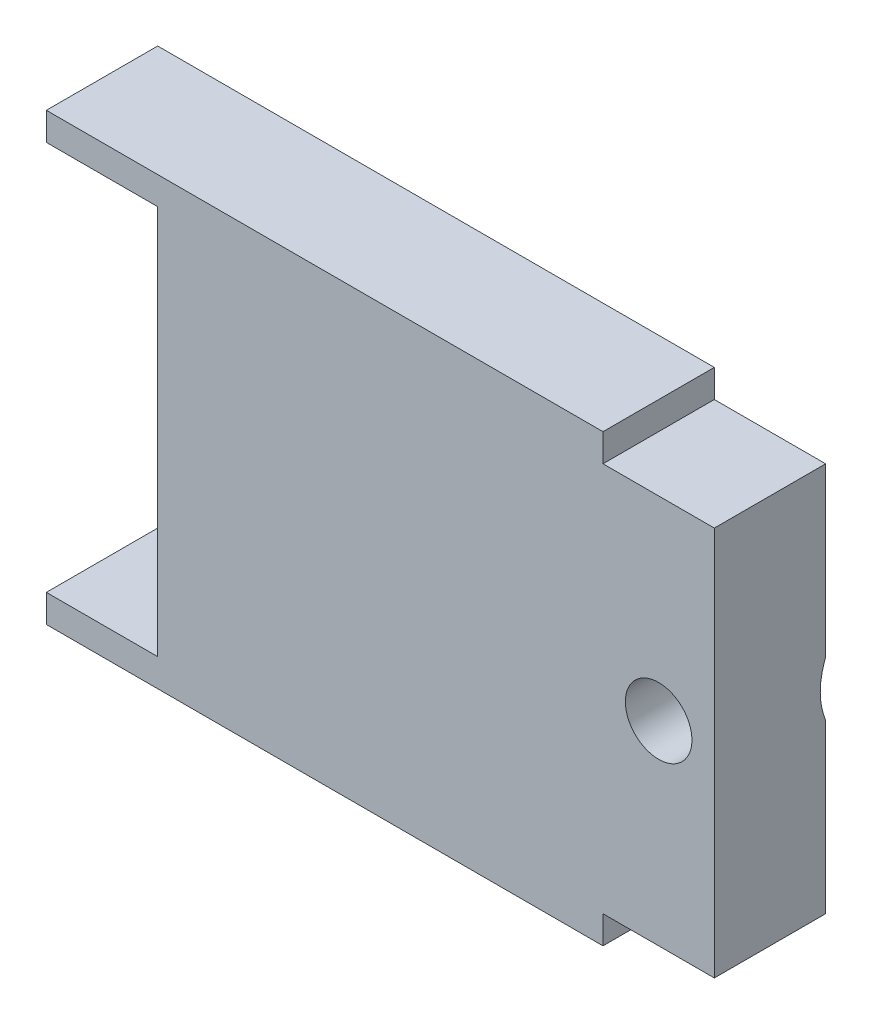
ISO-10303-21;
HEADER;
FILE_DESCRIPTION(('STEP AP214'),'2;1');
FILE_NAME('part.step','',(''),(''),'','','');
FILE_SCHEMA(('AUTOMOTIVE_DESIGN { 1 0 10303 214 1 1 1 1 }'));
ENDSEC;
DATA;
#1=APPLICATION_CONTEXT('core data for automotive mechanical design processes');
#2=APPLICATION_PROTOCOL_DEFINITION('international standard','automotive_design',2000,#1);
#3=PRODUCT_CONTEXT('',#1,'mechanical');
#4=PRODUCT('Part','Part','',(#3));
#5=PRODUCT_RELATED_PRODUCT_CATEGORY('part','',(#4));
#6=PRODUCT_DEFINITION_FORMATION('','',#4);
#7=PRODUCT_DEFINITION_CONTEXT('part definition',#1,'design');
#8=PRODUCT_DEFINITION('design','',#6,#7);
#9=PRODUCT_DEFINITION_SHAPE('','',#8);
#10=(LENGTH_UNIT() NAMED_UNIT(*) SI_UNIT(.MILLI.,.METRE.));
#11=(NAMED_UNIT(*) PLANE_ANGLE_UNIT() SI_UNIT($,.RADIAN.));
#12=(NAMED_UNIT(*) SI_UNIT($,.STERADIAN.) SOLID_ANGLE_UNIT());
#13=UNCERTAINTY_MEASURE_WITH_UNIT(LENGTH_MEASURE(1.E-05),#10,'distance_accuracy_value','');
#14=(GEOMETRIC_REPRESENTATION_CONTEXT(3) GLOBAL_UNCERTAINTY_ASSIGNED_CONTEXT((#13)) GLOBAL_UNIT_ASSIGNED_CONTEXT((#10,
#11,#12)) REPRESENTATION_CONTEXT('',''));
#15=CARTESIAN_POINT('',(0.,0.,0.));
#16=DIRECTION('',(0.,0.,1.));
#17=DIRECTION('',(1.,0.,0.));
#18=AXIS2_PLACEMENT_3D('',#15,#16,#17);
#19=CARTESIAN_POINT('',(-6.35,0.,6.35));
#20=DIRECTION('',(1.,0.,0.));
#21=DIRECTION('',(0.,1.,0.));
#22=AXIS2_PLACEMENT_3D('',#19,#20,#21);
#23=PLANE('',#22);
#24=DIRECTION('',(0.,-1.,0.));
#25=VECTOR('',#24,1.);
#26=CARTESIAN_POINT('',(-6.35,0.,0.));
#27=LINE('',#26,#25);
#28=CARTESIAN_POINT('',(-6.35,1.5875,0.));
#29=VERTEX_POINT('',#28);
#30=CARTESIAN_POINT('',(-6.35,0.,0.));
#31=VERTEX_POINT('',#30);
#32=EDGE_CURVE('E184',#29,#31,#27,.T.);
#33=ORIENTED_EDGE('',*,*,#32,.F.);
#34=DIRECTION('',(0.,0.,-1.));
#35=VECTOR('',#34,1.);
#36=CARTESIAN_POINT('',(-6.35,1.5875,6.35));
#37=LINE('',#36,#35);
#38=CARTESIAN_POINT('',(-6.35,1.5875,6.35));
#39=VERTEX_POINT('',#38);
#40=EDGE_CURVE('E40',#39,#29,#37,.T.);
#41=ORIENTED_EDGE('',*,*,#40,.F.);
#42=DIRECTION('',(0.,-1.,0.));
#43=VECTOR('',#42,1.);
#44=CARTESIAN_POINT('',(-6.35,0.,6.35));
#45=LINE('',#44,#43);
#46=CARTESIAN_POINT('',(-6.35,0.,6.35));
#47=VERTEX_POINT('',#46);
#48=EDGE_CURVE('E178',#39,#47,#45,.T.);
#49=ORIENTED_EDGE('',*,*,#48,.T.);
#50=DIRECTION('',(0.,0.,-1.));
#51=VECTOR('',#50,1.);
#52=CARTESIAN_POINT('',(-6.35,0.,6.35));
#53=LINE('',#52,#51);
#54=EDGE_CURVE('E54',#47,#31,#53,.T.);
#55=ORIENTED_EDGE('',*,*,#54,.T.);
#56=EDGE_LOOP('',(#33,#41,#49,#55));
#57=FACE_BOUND('',#56,.T.);
#58=ADVANCED_FACE('F33',(#57),#23,.T.);
#59=CARTESIAN_POINT('',(0.,1.5875,6.35));
#60=DIRECTION('',(0.,-1.,0.));
#61=DIRECTION('',(1.,0.,0.));
#62=AXIS2_PLACEMENT_3D('',#59,#60,#61);
#63=PLANE('',#62);
#64=DIRECTION('',(-1.,0.,0.));
#65=VECTOR('',#64,1.);
#66=CARTESIAN_POINT('',(0.,1.5875,0.));
#67=LINE('',#66,#65);
#68=CARTESIAN_POINT('',(0.,1.5875,0.));
#69=VERTEX_POINT('',#68);
#70=EDGE_CURVE('E261',#69,#29,#67,.T.);
#71=ORIENTED_EDGE('',*,*,#70,.F.);
#72=DIRECTION('',(0.,0.,-1.));
#73=VECTOR('',#72,1.);
#74=CARTESIAN_POINT('',(0.,1.5875,6.35));
#75=LINE('',#74,#73);
#76=CARTESIAN_POINT('',(0.,1.5875,6.35));
#77=VERTEX_POINT('',#76);
#78=EDGE_CURVE('E309',#77,#69,#75,.T.);
#79=ORIENTED_EDGE('',*,*,#78,.F.);
#80=DIRECTION('',(-1.,0.,0.));
#81=VECTOR('',#80,1.);
#82=CARTESIAN_POINT('',(0.,1.5875,6.35));
#83=LINE('',#82,#81);
#84=EDGE_CURVE('E175',#77,#39,#83,.T.);
#85=ORIENTED_EDGE('',*,*,#84,.T.);
#86=ORIENTED_EDGE('',*,*,#40,.T.);
#87=EDGE_LOOP('',(#71,#79,#85,#86));
#88=FACE_BOUND('',#87,.T.);
#89=ADVANCED_FACE('F252',(#88),#63,.T.);
#90=CARTESIAN_POINT('',(0.,0.,6.35));
#91=DIRECTION('',(-1.,0.,0.));
#92=DIRECTION('',(0.,-1.,0.));
#93=AXIS2_PLACEMENT_3D('',#90,#91,#92);
#94=PLANE('',#93);
#95=DIRECTION('',(0.,1.,0.));
#96=VECTOR('',#95,1.);
#97=CARTESIAN_POINT('',(0.,0.,0.));
#98=LINE('',#97,#96);
#99=CARTESIAN_POINT('',(0.,11.126993359836,0.));
#100=VERTEX_POINT('',#99);
#101=EDGE_CURVE('E267',#69,#100,#98,.T.);
#102=ORIENTED_EDGE('',*,*,#101,.T.);
#103=CARTESIAN_POINT('',(0.,-1.56658730474791,-9.29077360985219));
#104=CARTESIAN_POINT('',(0.,-1.16317084431735,-8.96037932404535));
#105=CARTESIAN_POINT('',(0.,-0.759456326242653,-8.63034755380192));
#106=CARTESIAN_POINT('',(0.,0.0488607889960544,-7.97128256367705));
#107=CARTESIAN_POINT('',(0.,0.453463479101647,-7.64224945781425));
#108=CARTESIAN_POINT('',(0.,1.26534390944595,-6.98424463935165));
#109=CARTESIAN_POINT('',(0.,1.67262592393552,-6.6552781948735));
#110=CARTESIAN_POINT('',(0.,2.48865166465612,-5.99924655453938));
#111=CARTESIAN_POINT('',(0.,2.89739524092196,-5.67218117217986));
#112=CARTESIAN_POINT('',(0.,3.77711329561519,-4.97285681156877));
#113=CARTESIAN_POINT('',(0.,4.2484166639456,-4.60101006547359));
#114=CARTESIAN_POINT('',(0.,4.95866559941069,-4.04729672650449));
#115=CARTESIAN_POINT('',(0.,5.19600477293552,-3.86337088206531));
#116=CARTESIAN_POINT('',(0.,5.67206601718016,-3.49732411668086));
#117=CARTESIAN_POINT('',(0.,5.91078806306058,-3.31520316347414));
#118=CARTESIAN_POINT('',(0.,6.38950773653385,-2.95373993443865));
#119=CARTESIAN_POINT('',(0.,6.62950140914656,-2.77439243269626));
#120=CARTESIAN_POINT('',(0.,7.11187119159386,-2.41893858179694));
#121=CARTESIAN_POINT('',(0.,7.35424723434449,-2.2428321417754));
#122=CARTESIAN_POINT('',(0.,7.84212635356779,-1.89524928592059));
#123=CARTESIAN_POINT('',(0.,8.08762770386774,-1.72377046464304));
#124=CARTESIAN_POINT('',(0.,8.45927964502981,-1.47159822000848));
#125=CARTESIAN_POINT('',(0.,8.58372139732299,-1.38838748371445));
#126=CARTESIAN_POINT('',(0.,8.83397325806667,-1.22405291134985));
#127=CARTESIAN_POINT('',(0.,8.95978331400082,-1.14292899558518));
#128=CARTESIAN_POINT('',(0.,9.18398918978552,-1.00160210652025));
#129=CARTESIAN_POINT('',(0.,9.28205115497181,-0.940870042412866));
#130=CARTESIAN_POINT('',(0.,9.47930720706571,-0.821259425276414));
#131=CARTESIAN_POINT('',(0.,9.5785013387505,-0.762380945905163));
#132=CARTESIAN_POINT('',(0.,9.7782678151677,-0.646821308072826));
#133=CARTESIAN_POINT('',(0.,9.87884116149368,-0.590141874930249));
#134=CARTESIAN_POINT('',(0.,10.0814833794035,-0.479520213800641));
#135=CARTESIAN_POINT('',(0.,10.1835522244183,-0.425577937260965));
#136=CARTESIAN_POINT('',(0.,10.3879905317005,-0.321765125893339));
#137=CARTESIAN_POINT('',(0.,10.4903364647706,-0.271848721324765));
#138=CARTESIAN_POINT('',(0.,10.6968881483524,-0.176034049091856));
#139=CARTESIAN_POINT('',(0.,10.8010941359354,-0.130136298087297));
#140=CARTESIAN_POINT('',(0.,11.1165653109808,7.40068921167191E-05));
#141=CARTESIAN_POINT('',(0.,11.3310419762915,0.0770924180092445));
#142=CARTESIAN_POINT('',(0.,11.6659160484658,0.172793892276216));
#143=CARTESIAN_POINT('',(0.,11.7833398611401,0.201905513949137));
#144=CARTESIAN_POINT('',(0.,12.0202063374046,0.250362845375069));
#145=CARTESIAN_POINT('',(0.,12.1396485474588,0.269710719671602));
#146=CARTESIAN_POINT('',(0.,12.3791436061835,0.297308963464408));
#147=CARTESIAN_POINT('',(0.,12.4991891318375,0.305621748641971));
#148=CARTESIAN_POINT('',(0.,12.7395360715023,0.310740843297209));
#149=CARTESIAN_POINT('',(0.,12.8598374916924,0.307546871691886));
#150=CARTESIAN_POINT('',(0.,13.0939034283073,0.290315054895521));
#151=CARTESIAN_POINT('',(0.,13.2077074350133,0.276798546872065));
#152=CARTESIAN_POINT('',(0.,13.433787128278,0.240401669990354));
#153=CARTESIAN_POINT('',(0.,13.5460627266949,0.217520763438821));
#154=CARTESIAN_POINT('',(0.,13.7703729287966,0.163187593829832));
#155=CARTESIAN_POINT('',(0.,13.8823758215169,0.13160587501465));
#156=CARTESIAN_POINT('',(0.,14.0486640151447,0.0789711408135964));
#157=CARTESIAN_POINT('',(0.,14.1038038820635,0.0605505633474383));
#158=CARTESIAN_POINT('',(0.,14.2135228316568,0.0221155469994278));
#159=CARTESIAN_POINT('',(0.,14.2681019424867,0.0021011885870689));
#160=CARTESIAN_POINT('',(0.,14.4422785845045,-0.0643999179590312));
#161=CARTESIAN_POINT('',(0.,14.5608166947032,-0.113673371401337));
#162=CARTESIAN_POINT('',(0.,14.7954418680653,-0.217779016213246));
#163=CARTESIAN_POINT('',(0.,14.9115280484169,-0.272613169825437));
#164=CARTESIAN_POINT('',(0.,15.1416620243079,-0.386751111562363));
#165=CARTESIAN_POINT('',(0.,15.2557069143938,-0.446060727140383));
#166=CARTESIAN_POINT('',(0.,15.4818815752179,-0.568176637891786));
#167=CARTESIAN_POINT('',(0.,15.5940115607107,-0.630982537550297));
#168=CARTESIAN_POINT('',(0.,15.8173752101801,-0.759824419947471));
#169=CARTESIAN_POINT('',(0.,15.9285981771512,-0.825878880910427));
#170=CARTESIAN_POINT('',(0.,16.1496429449781,-0.960296587384627));
#171=CARTESIAN_POINT('',(0.,16.2594646728709,-1.02865995245094));
#172=CARTESIAN_POINT('',(0.,16.586986700131,-1.23645455184094));
#173=CARTESIAN_POINT('',(0.,16.8029089060839,-1.37868725201348));
#174=CARTESIAN_POINT('',(0.,17.2081979154051,-1.6526664589612));
#175=CARTESIAN_POINT('',(0.,17.3979200468933,-1.78389238455581));
#176=CARTESIAN_POINT('',(0.,17.7752627859939,-2.04939917057513));
#177=CARTESIAN_POINT('',(0.,17.9628830105511,-2.18368057474285));
#178=CARTESIAN_POINT('',(0.,18.3338878637288,-2.45266623563545));
#179=CARTESIAN_POINT('',(0.,18.5172952429946,-2.5873392157356));
#180=CARTESIAN_POINT('',(0.,18.8827560201199,-2.85840696553926));
#181=CARTESIAN_POINT('',(0.,19.064809776974,-2.99480125082081));
#182=CARTESIAN_POINT('',(0.,19.2463692958954,-3.13184193922765));
#183=B_SPLINE_CURVE_WITH_KNOTS('',3,(#103,#104,#105,#106,#107,#108,#109,#110,#111,#112,#113,
#114,#115,#116,#117,#118,#119,#120,#121,#122,#123,#124,#125,#126,#127,#128,#129,#130,#131,#132,
#133,#134,#135,#136,#137,#138,#139,#140,#141,#142,#143,#144,#145,#146,#147,#148,#149,#150,#151,
#152,#153,#154,#155,#156,#157,#158,#159,#160,#161,#162,#163,#164,#165,#166,#167,#168,#169,#170,
#171,#172,#173,#174,#175,#176,#177,#178,#179,#180,#181,#182),.UNSPECIFIED.,.F.,.F.,(4,2,2,2,2,2,
2,2,2,2,2,2,2,2,2,2,2,2,2,2,2,2,2,2,2,2,2,2,2,2,2,2,2,2,2,2,2,2,2,4),(0.,1.5643370490145,
3.12884644487835,4.69947175571236,6.26994028779928,8.07090151759663,8.97168784902409,
9.87245805023653,10.7712491580218,11.6700150292949,12.5683043524329,13.0173857851508,
13.4664500422473,13.8124692330174,14.1585021565992,14.5048012944896,14.8510942874552,
15.1926148067104,15.5341791694099,16.2160961002167,16.5787024338588,16.9412283452674,
17.3016949074389,17.6621702750201,18.0055538883072,18.3489572210636,18.6977749650289,
18.8721613071293,19.0465388500945,19.4314505116021,19.8164984753275,20.2020567572303,
20.5875715113867,20.9756139034837,21.3636764193158,22.1392274961834,22.8312461080853,
23.5233888476747,24.2060020484508,24.8884272473546),.UNSPECIFIED.);
#184=CARTESIAN_POINT('',(0.,14.273006640164,0.));
#185=VERTEX_POINT('',#184);
#186=EDGE_CURVE('E46',#100,#185,#183,.T.);
#187=ORIENTED_EDGE('',*,*,#186,.T.);
#188=CARTESIAN_POINT('',(0.,23.8125,0.));
#189=VERTEX_POINT('',#188);
#190=EDGE_CURVE('E268',#185,#189,#98,.T.);
#191=ORIENTED_EDGE('',*,*,#190,.T.);
#192=DIRECTION('',(0.,0.,-1.));
#193=VECTOR('',#192,1.);
#194=CARTESIAN_POINT('',(0.,23.8125,6.35));
#195=LINE('',#194,#193);
#196=CARTESIAN_POINT('',(0.,23.8125,6.35));
#197=VERTEX_POINT('',#196);
#198=EDGE_CURVE('E306',#197,#189,#195,.T.);
#199=ORIENTED_EDGE('',*,*,#198,.F.);
#200=DIRECTION('',(0.,1.,0.));
#201=VECTOR('',#200,1.);
#202=CARTESIAN_POINT('',(0.,0.,6.35));
#203=LINE('',#202,#201);
#204=EDGE_CURVE('E173',#77,#197,#203,.T.);
#205=ORIENTED_EDGE('',*,*,#204,.F.);
#206=ORIENTED_EDGE('',*,*,#78,.T.);
#207=EDGE_LOOP('',(#102,#187,#191,#199,#205,#206));
#208=FACE_BOUND('',#207,.T.);
#209=ADVANCED_FACE('F196',(#208),#94,.F.);
#210=CARTESIAN_POINT('',(0.,23.8125,6.35));
#211=DIRECTION('',(0.,-1.,0.));
#212=DIRECTION('',(1.,0.,0.));
#213=AXIS2_PLACEMENT_3D('',#210,#211,#212);
#214=PLANE('',#213);
#215=DIRECTION('',(-1.,0.,0.));
#216=VECTOR('',#215,1.);
#217=CARTESIAN_POINT('',(0.,23.8125,0.));
#218=LINE('',#217,#216);
#219=CARTESIAN_POINT('',(-6.35,23.8125,0.));
#220=VERTEX_POINT('',#219);
#221=EDGE_CURVE('E272',#189,#220,#218,.T.);
#222=ORIENTED_EDGE('',*,*,#221,.T.);
#223=DIRECTION('',(0.,0.,-1.));
#224=VECTOR('',#223,1.);
#225=CARTESIAN_POINT('',(-6.35,23.8125,6.35));
#226=LINE('',#225,#224);
#227=CARTESIAN_POINT('',(-6.35,23.8125,6.35));
#228=VERTEX_POINT('',#227);
#229=EDGE_CURVE('E303',#228,#220,#226,.T.);
#230=ORIENTED_EDGE('',*,*,#229,.F.);
#231=DIRECTION('',(-1.,0.,0.));
#232=VECTOR('',#231,1.);
#233=CARTESIAN_POINT('',(0.,23.8125,6.35));
#234=LINE('',#233,#232);
#235=EDGE_CURVE('E169',#197,#228,#234,.T.);
#236=ORIENTED_EDGE('',*,*,#235,.F.);
#237=ORIENTED_EDGE('',*,*,#198,.T.);
#238=EDGE_LOOP('',(#222,#230,#236,#237));
#239=FACE_BOUND('',#238,.T.);
#240=ADVANCED_FACE('F245',(#239),#214,.F.);
#241=CARTESIAN_POINT('',(-6.35000000000001,0.,6.35));
#242=DIRECTION('',(-1.,0.,0.));
#243=DIRECTION('',(0.,-1.,0.));
#244=AXIS2_PLACEMENT_3D('',#241,#242,#243);
#245=PLANE('',#244);
#246=DIRECTION('',(0.,1.,0.));
#247=VECTOR('',#246,1.);
#248=CARTESIAN_POINT('',(-6.35000000000001,0.,0.));
#249=LINE('',#248,#247);
#250=CARTESIAN_POINT('',(-6.35,25.4,0.));
#251=VERTEX_POINT('',#250);
#252=EDGE_CURVE('E274',#220,#251,#249,.T.);
#253=ORIENTED_EDGE('',*,*,#252,.T.);
#254=DIRECTION('',(0.,0.,-1.));
#255=VECTOR('',#254,1.);
#256=CARTESIAN_POINT('',(-6.35,25.4,6.35));
#257=LINE('',#256,#255);
#258=CARTESIAN_POINT('',(-6.35,25.4,6.35));
#259=VERTEX_POINT('',#258);
#260=EDGE_CURVE('E300',#259,#251,#257,.T.);
#261=ORIENTED_EDGE('',*,*,#260,.F.);
#262=DIRECTION('',(0.,1.,0.));
#263=VECTOR('',#262,1.);
#264=CARTESIAN_POINT('',(-6.35000000000001,0.,6.35));
#265=LINE('',#264,#263);
#266=EDGE_CURVE('E166',#228,#259,#265,.T.);
#267=ORIENTED_EDGE('',*,*,#266,.F.);
#268=ORIENTED_EDGE('',*,*,#229,.T.);
#269=EDGE_LOOP('',(#253,#261,#267,#268));
#270=FACE_BOUND('',#269,.T.);
#271=ADVANCED_FACE('F242',(#270),#245,.F.);
#272=CARTESIAN_POINT('',(0.,25.4,6.35));
#273=DIRECTION('',(0.,-1.,0.));
#274=DIRECTION('',(1.,0.,0.));
#275=AXIS2_PLACEMENT_3D('',#272,#273,#274);
#276=PLANE('',#275);
#277=DIRECTION('',(-1.,0.,0.));
#278=VECTOR('',#277,1.);
#279=CARTESIAN_POINT('',(0.,25.4,0.));
#280=LINE('',#279,#278);
#281=CARTESIAN_POINT('',(-38.1,25.4,0.));
#282=VERTEX_POINT('',#281);
#283=EDGE_CURVE('E276',#251,#282,#280,.T.);
#284=ORIENTED_EDGE('',*,*,#283,.T.);
#285=DIRECTION('',(0.,0.,-1.));
#286=VECTOR('',#285,1.);
#287=CARTESIAN_POINT('',(-38.1,25.4,6.35));
#288=LINE('',#287,#286);
#289=CARTESIAN_POINT('',(-38.1,25.4,6.35));
#290=VERTEX_POINT('',#289);
#291=EDGE_CURVE('E298',#290,#282,#288,.T.);
#292=ORIENTED_EDGE('',*,*,#291,.F.);
#293=DIRECTION('',(-1.,0.,0.));
#294=VECTOR('',#293,1.);
#295=CARTESIAN_POINT('',(0.,25.4,6.35));
#296=LINE('',#295,#294);
#297=EDGE_CURVE('E163',#259,#290,#296,.T.);
#298=ORIENTED_EDGE('',*,*,#297,.F.);
#299=ORIENTED_EDGE('',*,*,#260,.T.);
#300=EDGE_LOOP('',(#284,#292,#298,#299));
#301=FACE_BOUND('',#300,.T.);
#302=ADVANCED_FACE('F239',(#301),#276,.F.);
#303=CARTESIAN_POINT('',(-38.1,0.,6.35));
#304=DIRECTION('',(-1.,0.,0.));
#305=DIRECTION('',(0.,0.,1.));
#306=AXIS2_PLACEMENT_3D('',#303,#304,#305);
#307=PLANE('',#306);
#308=DIRECTION('',(0.,1.,0.));
#309=VECTOR('',#308,1.);
#310=CARTESIAN_POINT('',(-38.1,0.,0.));
#311=LINE('',#310,#309);
#312=CARTESIAN_POINT('',(-38.1,23.8125,0.));
#313=VERTEX_POINT('',#312);
#314=EDGE_CURVE('E279',#313,#282,#311,.T.);
#315=ORIENTED_EDGE('',*,*,#314,.F.);
#316=DIRECTION('',(0.,0.,-1.));
#317=VECTOR('',#316,1.);
#318=CARTESIAN_POINT('',(-38.1,23.8125,6.35));
#319=LINE('',#318,#317);
#320=CARTESIAN_POINT('',(-38.1,23.8125,6.35));
#321=VERTEX_POINT('',#320);
#322=EDGE_CURVE('E296',#321,#313,#319,.T.);
#323=ORIENTED_EDGE('',*,*,#322,.F.);
#324=DIRECTION('',(0.,1.,0.));
#325=VECTOR('',#324,1.);
#326=CARTESIAN_POINT('',(-38.1,0.,6.35));
#327=LINE('',#326,#325);
#328=EDGE_CURVE('E157',#321,#290,#327,.T.);
#329=ORIENTED_EDGE('',*,*,#328,.T.);
#330=ORIENTED_EDGE('',*,*,#291,.T.);
#331=EDGE_LOOP('',(#315,#323,#329,#330));
#332=FACE_BOUND('',#331,.T.);
#333=ADVANCED_FACE('F228',(#332),#307,.T.);
#334=CARTESIAN_POINT('',(0.,23.8125,6.35));
#335=DIRECTION('',(0.,1.,0.));
#336=DIRECTION('',(0.,0.,1.));
#337=AXIS2_PLACEMENT_3D('',#334,#335,#336);
#338=PLANE('',#337);
#339=DIRECTION('',(1.,0.,0.));
#340=VECTOR('',#339,1.);
#341=CARTESIAN_POINT('',(0.,23.8125,0.));
#342=LINE('',#341,#340);
#343=CARTESIAN_POINT('',(-31.75,23.8125,0.));
#344=VERTEX_POINT('',#343);
#345=EDGE_CURVE('E282',#313,#344,#342,.T.);
#346=ORIENTED_EDGE('',*,*,#345,.T.);
#347=DIRECTION('',(0.,0.,-1.));
#348=VECTOR('',#347,1.);
#349=CARTESIAN_POINT('',(-31.75,23.8125,6.35));
#350=LINE('',#349,#348);
#351=CARTESIAN_POINT('',(-31.75,23.8125,6.35));
#352=VERTEX_POINT('',#351);
#353=EDGE_CURVE('E293',#352,#344,#350,.T.);
#354=ORIENTED_EDGE('',*,*,#353,.F.);
#355=DIRECTION('',(1.,0.,0.));
#356=VECTOR('',#355,1.);
#357=CARTESIAN_POINT('',(0.,23.8125,6.35));
#358=LINE('',#357,#356);
#359=EDGE_CURVE('E162',#321,#352,#358,.T.);
#360=ORIENTED_EDGE('',*,*,#359,.F.);
#361=ORIENTED_EDGE('',*,*,#322,.T.);
#362=EDGE_LOOP('',(#346,#354,#360,#361));
#363=FACE_BOUND('',#362,.T.);
#364=ADVANCED_FACE('F234',(#363),#338,.F.);
#365=CARTESIAN_POINT('',(-31.75,0.,6.35));
#366=DIRECTION('',(1.,0.,0.));
#367=DIRECTION('',(0.,0.,-1.));
#368=AXIS2_PLACEMENT_3D('',#365,#366,#367);
#369=PLANE('',#368);
#370=CARTESIAN_POINT('',(-31.75,12.7,3.175));
#371=DIRECTION('',(-1.,0.,0.));
#372=DIRECTION('',(0.,0.,1.));
#373=AXIS2_PLACEMENT_3D('',#370,#371,#372);
#374=CIRCLE('',#373,1.35254999999999);
#375=CARTESIAN_POINT('',(-31.75,12.7,4.52754999999999));
#376=VERTEX_POINT('',#375);
#377=EDGE_CURVE('E185',#376,#376,#374,.T.);
#378=ORIENTED_EDGE('',*,*,#377,.F.);
#379=EDGE_LOOP('',(#378));
#380=FACE_BOUND('',#379,.T.);
#381=DIRECTION('',(0.,-1.,0.));
#382=VECTOR('',#381,1.);
#383=CARTESIAN_POINT('',(-31.75,0.,0.));
#384=LINE('',#383,#382);
#385=CARTESIAN_POINT('',(-31.75,1.5875,0.));
#386=VERTEX_POINT('',#385);
#387=EDGE_CURVE('E285',#344,#386,#384,.T.);
#388=ORIENTED_EDGE('',*,*,#387,.T.);
#389=DIRECTION('',(0.,0.,-1.));
#390=VECTOR('',#389,1.);
#391=CARTESIAN_POINT('',(-31.75,1.5875,6.35));
#392=LINE('',#391,#390);
#393=CARTESIAN_POINT('',(-31.75,1.5875,6.35));
#394=VERTEX_POINT('',#393);
#395=EDGE_CURVE('E142',#394,#386,#392,.T.);
#396=ORIENTED_EDGE('',*,*,#395,.F.);
#397=DIRECTION('',(0.,-1.,0.));
#398=VECTOR('',#397,1.);
#399=CARTESIAN_POINT('',(-31.75,0.,6.35));
#400=LINE('',#399,#398);
#401=EDGE_CURVE('E151',#352,#394,#400,.T.);
#402=ORIENTED_EDGE('',*,*,#401,.F.);
#403=ORIENTED_EDGE('',*,*,#353,.T.);
#404=EDGE_LOOP('',(#388,#396,#402,#403));
#405=FACE_BOUND('',#404,.T.);
#406=ADVANCED_FACE('F231',(#380,#405),#369,.F.);
#407=CARTESIAN_POINT('',(0.,1.5875,6.35));
#408=DIRECTION('',(0.,1.,0.));
#409=DIRECTION('',(-1.,0.,0.));
#410=AXIS2_PLACEMENT_3D('',#407,#408,#409);
#411=PLANE('',#410);
#412=DIRECTION('',(1.,0.,0.));
#413=VECTOR('',#412,1.);
#414=CARTESIAN_POINT('',(0.,1.5875,0.));
#415=LINE('',#414,#413);
#416=CARTESIAN_POINT('',(-38.1,1.5875,0.));
#417=VERTEX_POINT('',#416);
#418=EDGE_CURVE('E137',#417,#386,#415,.T.);
#419=ORIENTED_EDGE('',*,*,#418,.F.);
#420=DIRECTION('',(0.,0.,-1.));
#421=VECTOR('',#420,1.);
#422=CARTESIAN_POINT('',(-38.1,1.5875,6.35));
#423=LINE('',#422,#421);
#424=CARTESIAN_POINT('',(-38.1,1.5875,6.35));
#425=VERTEX_POINT('',#424);
#426=EDGE_CURVE('E132',#425,#417,#423,.T.);
#427=ORIENTED_EDGE('',*,*,#426,.F.);
#428=DIRECTION('',(1.,0.,0.));
#429=VECTOR('',#428,1.);
#430=CARTESIAN_POINT('',(0.,1.5875,6.35));
#431=LINE('',#430,#429);
#432=EDGE_CURVE('E135',#425,#394,#431,.T.);
#433=ORIENTED_EDGE('',*,*,#432,.T.);
#434=ORIENTED_EDGE('',*,*,#395,.T.);
#435=EDGE_LOOP('',(#419,#427,#433,#434));
#436=FACE_BOUND('',#435,.T.);
#437=ADVANCED_FACE('F134',(#436),#411,.T.);
#438=CARTESIAN_POINT('',(-38.1,0.,0.));
#439=VERTEX_POINT('',#438);
#440=EDGE_CURVE('E283',#439,#417,#311,.T.);
#441=ORIENTED_EDGE('',*,*,#440,.F.);
#442=DIRECTION('',(0.,0.,-1.));
#443=VECTOR('',#442,1.);
#444=CARTESIAN_POINT('',(-38.1,0.,6.35));
#445=LINE('',#444,#443);
#446=CARTESIAN_POINT('',(-38.1,0.,6.35));
#447=VERTEX_POINT('',#446);
#448=EDGE_CURVE('E143',#447,#439,#445,.T.);
#449=ORIENTED_EDGE('',*,*,#448,.F.);
#450=EDGE_CURVE('E149',#447,#425,#327,.T.);
#451=ORIENTED_EDGE('',*,*,#450,.T.);
#452=ORIENTED_EDGE('',*,*,#426,.T.);
#453=EDGE_LOOP('',(#441,#449,#451,#452));
#454=FACE_BOUND('',#453,.T.);
#455=ADVANCED_FACE('F154',(#454),#307,.T.);
#456=CARTESIAN_POINT('',(0.,0.,6.35));
#457=DIRECTION('',(0.,-1.,0.));
#458=DIRECTION('',(1.,0.,0.));
#459=AXIS2_PLACEMENT_3D('',#456,#457,#458);
#460=PLANE('',#459);
#461=DIRECTION('',(-1.,0.,0.));
#462=VECTOR('',#461,1.);
#463=CARTESIAN_POINT('',(0.,0.,0.));
#464=LINE('',#463,#462);
#465=EDGE_CURVE('E180',#31,#439,#464,.T.);
#466=ORIENTED_EDGE('',*,*,#465,.F.);
#467=ORIENTED_EDGE('',*,*,#54,.F.);
#468=DIRECTION('',(-1.,0.,0.));
#469=VECTOR('',#468,1.);
#470=CARTESIAN_POINT('',(0.,0.,6.35));
#471=LINE('',#470,#469);
#472=EDGE_CURVE('E155',#47,#447,#471,.T.);
#473=ORIENTED_EDGE('',*,*,#472,.T.);
#474=ORIENTED_EDGE('',*,*,#448,.T.);
#475=EDGE_LOOP('',(#466,#467,#473,#474));
#476=FACE_BOUND('',#475,.T.);
#477=ADVANCED_FACE('F219',(#476),#460,.T.);
#478=CARTESIAN_POINT('',(0.,0.,6.35));
#479=DIRECTION('',(0.,0.,1.));
#480=DIRECTION('',(1.,0.,0.));
#481=AXIS2_PLACEMENT_3D('',#478,#479,#480);
#482=PLANE('',#481);
#483=CARTESIAN_POINT('',(-3.175,12.7,6.34999999999999));
#484=DIRECTION('',(0.,0.,-1.));
#485=DIRECTION('',(-1.,0.,0.));
#486=AXIS2_PLACEMENT_3D('',#483,#484,#485);
#487=CIRCLE('',#486,1.89864999999999);
#488=CARTESIAN_POINT('',(-5.07364999999999,12.7,6.34999999999999));
#489=VERTEX_POINT('',#488);
#490=EDGE_CURVE('E194',#489,#489,#487,.T.);
#491=ORIENTED_EDGE('',*,*,#490,.T.);
#492=EDGE_LOOP('',(#491));
#493=FACE_BOUND('',#492,.T.);
#494=ORIENTED_EDGE('',*,*,#48,.F.);
#495=ORIENTED_EDGE('',*,*,#84,.F.);
#496=ORIENTED_EDGE('',*,*,#204,.T.);
#497=ORIENTED_EDGE('',*,*,#235,.T.);
#498=ORIENTED_EDGE('',*,*,#266,.T.);
#499=ORIENTED_EDGE('',*,*,#297,.T.);
#500=ORIENTED_EDGE('',*,*,#328,.F.);
#501=ORIENTED_EDGE('',*,*,#359,.T.);
#502=ORIENTED_EDGE('',*,*,#401,.T.);
#503=ORIENTED_EDGE('',*,*,#432,.F.);
#504=ORIENTED_EDGE('',*,*,#450,.F.);
#505=ORIENTED_EDGE('',*,*,#472,.F.);
#506=EDGE_LOOP('',(#494,#495,#496,#497,#498,#499,#500,#501,#502,#503,#504,#505));
#507=FACE_BOUND('',#506,.T.);
#508=ADVANCED_FACE('F147',(#493,#507),#482,.T.);
#509=CARTESIAN_POINT('',(0.,0.,0.));
#510=DIRECTION('',(0.,0.,1.));
#511=DIRECTION('',(1.,0.,0.));
#512=AXIS2_PLACEMENT_3D('',#509,#510,#511);
#513=PLANE('',#512);
#514=ORIENTED_EDGE('',*,*,#190,.F.);
#515=CARTESIAN_POINT('',(-3.175,12.7,0.));
#516=DIRECTION('',(0.,0.,1.));
#517=DIRECTION('',(1.,0.,0.));
#518=AXIS2_PLACEMENT_3D('',#515,#516,#517);
#519=CIRCLE('',#518,3.5433);
#520=EDGE_CURVE('E11',#185,#100,#519,.T.);
#521=ORIENTED_EDGE('',*,*,#520,.T.);
#522=ORIENTED_EDGE('',*,*,#101,.F.);
#523=ORIENTED_EDGE('',*,*,#70,.T.);
#524=ORIENTED_EDGE('',*,*,#32,.T.);
#525=ORIENTED_EDGE('',*,*,#465,.T.);
#526=ORIENTED_EDGE('',*,*,#440,.T.);
#527=ORIENTED_EDGE('',*,*,#418,.T.);
#528=ORIENTED_EDGE('',*,*,#387,.F.);
#529=ORIENTED_EDGE('',*,*,#345,.F.);
#530=ORIENTED_EDGE('',*,*,#314,.T.);
#531=ORIENTED_EDGE('',*,*,#283,.F.);
#532=ORIENTED_EDGE('',*,*,#252,.F.);
#533=ORIENTED_EDGE('',*,*,#221,.F.);
#534=EDGE_LOOP('',(#514,#521,#522,#523,#524,#525,#526,#527,#528,#529,#530,#531,#532,#533));
#535=FACE_BOUND('',#534,.T.);
#536=ADVANCED_FACE('F215',(#535),#513,.F.);
#537=CARTESIAN_POINT('',(-19.05,12.7,3.175));
#538=DIRECTION('',(-1.,0.,0.));
#539=DIRECTION('',(0.,0.,1.));
#540=AXIS2_PLACEMENT_3D('',#537,#538,#539);
#541=CONICAL_SURFACE('',#540,1.35255,1.02974425867665);
#542=CARTESIAN_POINT('',(-18.2373059697343,12.7,3.175));
#543=VERTEX_POINT('',#542);
#544=VERTEX_LOOP('',#543);
#545=FACE_BOUND('',#544,.T.);
#546=CARTESIAN_POINT('',(-19.05,12.7,3.175));
#547=DIRECTION('',(-1.,0.,0.));
#548=DIRECTION('',(0.,0.,1.));
#549=AXIS2_PLACEMENT_3D('',#546,#547,#548);
#550=CIRCLE('',#549,1.35255);
#551=CARTESIAN_POINT('',(-19.05,12.7,4.52755));
#552=VERTEX_POINT('',#551);
#553=EDGE_CURVE('E181',#552,#552,#550,.T.);
#554=ORIENTED_EDGE('',*,*,#553,.T.);
#555=EDGE_LOOP('',(#554));
#556=FACE_BOUND('',#555,.T.);
#557=ADVANCED_FACE('F211',(#545,#556),#541,.F.);
#558=CARTESIAN_POINT('',(-31.75,12.7,3.175));
#559=DIRECTION('',(-1.,0.,0.));
#560=DIRECTION('',(0.,0.,1.));
#561=AXIS2_PLACEMENT_3D('',#558,#559,#560);
#562=CYLINDRICAL_SURFACE('',#561,1.35254999999999);
#563=ORIENTED_EDGE('',*,*,#553,.F.);
#564=EDGE_LOOP('',(#563));
#565=FACE_BOUND('',#564,.T.);
#566=ORIENTED_EDGE('',*,*,#377,.T.);
#567=EDGE_LOOP('',(#566));
#568=FACE_BOUND('',#567,.T.);
#569=ADVANCED_FACE('F204',(#565,#568),#562,.F.);
#570=CARTESIAN_POINT('',(-3.175,12.7,0.));
#571=DIRECTION('',(0.,0.,-1.));
#572=DIRECTION('',(-1.,0.,0.));
#573=AXIS2_PLACEMENT_3D('',#570,#571,#572);
#574=CONICAL_SURFACE('',#573,3.5433,0.872664625997169);
#575=CARTESIAN_POINT('',(-3.175,12.7,1.38002520841571));
#576=DIRECTION('',(0.,0.,-1.));
#577=DIRECTION('',(-1.,0.,0.));
#578=AXIS2_PLACEMENT_3D('',#575,#576,#577);
#579=CIRCLE('',#578,1.89864999999999);
#580=CARTESIAN_POINT('',(-5.07364999999999,12.7,1.38002520841571));
#581=VERTEX_POINT('',#580);
#582=EDGE_CURVE('E443',#581,#581,#579,.T.);
#583=ORIENTED_EDGE('',*,*,#582,.F.);
#584=EDGE_LOOP('',(#583));
#585=FACE_BOUND('',#584,.T.);
#586=ORIENTED_EDGE('',*,*,#520,.F.);
#587=ORIENTED_EDGE('',*,*,#186,.F.);
#588=EDGE_LOOP('',(#586,#587));
#589=FACE_BOUND('',#588,.T.);
#590=ADVANCED_FACE('F199',(#585,#589),#574,.F.);
#591=CARTESIAN_POINT('',(-3.175,12.7,0.));
#592=DIRECTION('',(0.,0.,-1.));
#593=DIRECTION('',(-1.,0.,0.));
#594=AXIS2_PLACEMENT_3D('',#591,#592,#593);
#595=CYLINDRICAL_SURFACE('',#594,1.89864999999999);
#596=ORIENTED_EDGE('',*,*,#490,.F.);
#597=EDGE_LOOP('',(#596));
#598=FACE_BOUND('',#597,.T.);
#599=ORIENTED_EDGE('',*,*,#582,.T.);
#600=EDGE_LOOP('',(#599));
#601=FACE_BOUND('',#600,.T.);
#602=ADVANCED_FACE('F203',(#598,#601),#595,.F.);
#603=CLOSED_SHELL('',(#58,#89,#209,#240,#271,#302,#333,#364,#406,#437,#455,#477,#508,#536,#557,
#569,#590,#602));
#604=MANIFOLD_SOLID_BREP('B2',#603);
#605=ADVANCED_BREP_SHAPE_REPRESENTATION('',(#18,#604),#14);
#606=SHAPE_DEFINITION_REPRESENTATION(#9,#605);
ENDSEC;
END-ISO-10303-21;
